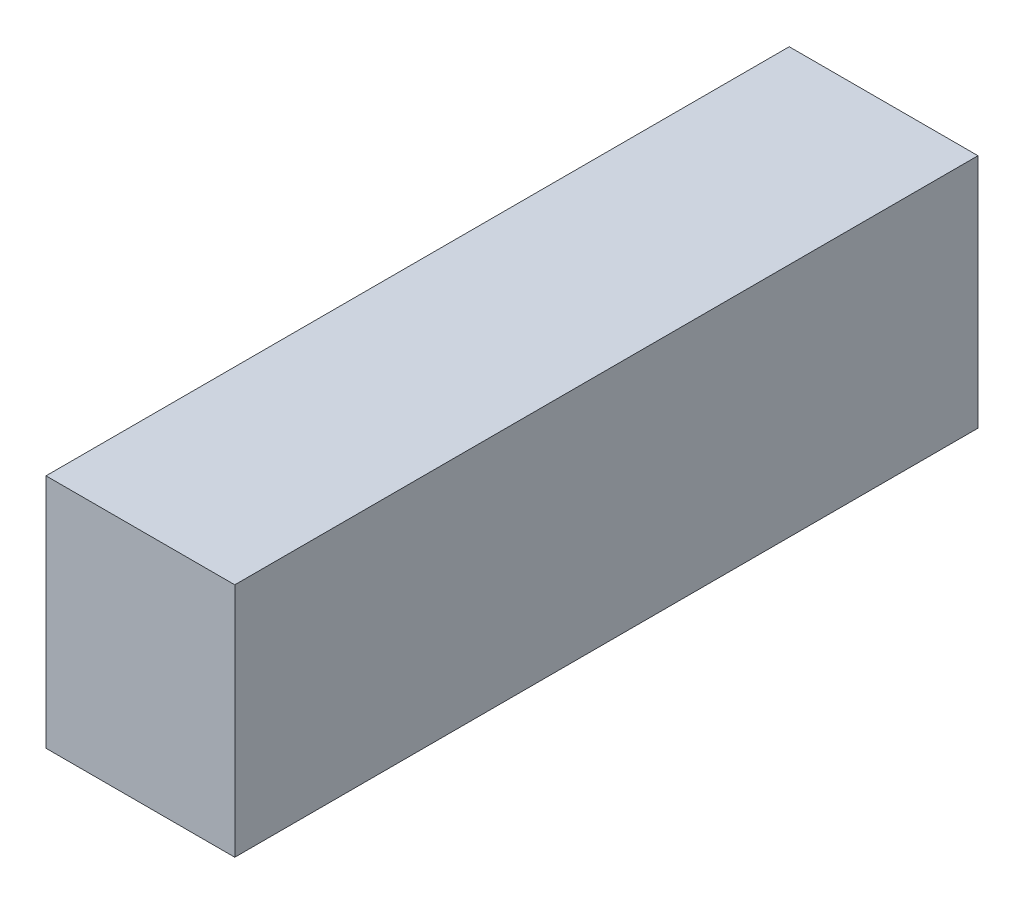
ISO-10303-21;
HEADER;
FILE_DESCRIPTION(('STEP AP214'),'2;1');
FILE_NAME('part.step','',(''),(''),'','','');
FILE_SCHEMA(('AUTOMOTIVE_DESIGN { 1 0 10303 214 1 1 1 1 }'));
ENDSEC;
DATA;
#1=APPLICATION_CONTEXT('core data for automotive mechanical design processes');
#2=APPLICATION_PROTOCOL_DEFINITION('international standard','automotive_design',2000,#1);
#3=PRODUCT_CONTEXT('',#1,'mechanical');
#4=PRODUCT('Part','Part','',(#3));
#5=PRODUCT_RELATED_PRODUCT_CATEGORY('part','',(#4));
#6=PRODUCT_DEFINITION_FORMATION('','',#4);
#7=PRODUCT_DEFINITION_CONTEXT('part definition',#1,'design');
#8=PRODUCT_DEFINITION('design','',#6,#7);
#9=PRODUCT_DEFINITION_SHAPE('','',#8);
#10=(LENGTH_UNIT() NAMED_UNIT(*) SI_UNIT(.MILLI.,.METRE.));
#11=(NAMED_UNIT(*) PLANE_ANGLE_UNIT() SI_UNIT($,.RADIAN.));
#12=(NAMED_UNIT(*) SI_UNIT($,.STERADIAN.) SOLID_ANGLE_UNIT());
#13=UNCERTAINTY_MEASURE_WITH_UNIT(LENGTH_MEASURE(1.E-05),#10,'distance_accuracy_value','');
#14=(GEOMETRIC_REPRESENTATION_CONTEXT(3) GLOBAL_UNCERTAINTY_ASSIGNED_CONTEXT((#13)) GLOBAL_UNIT_ASSIGNED_CONTEXT((#10,
#11,#12)) REPRESENTATION_CONTEXT('',''));
#15=CARTESIAN_POINT('',(0.,0.,0.));
#16=DIRECTION('',(0.,0.,1.));
#17=DIRECTION('',(1.,0.,0.));
#18=AXIS2_PLACEMENT_3D('',#15,#16,#17);
#19=CARTESIAN_POINT('',(3.175,2.38125,-304.8));
#20=DIRECTION('',(1.,0.,0.));
#21=DIRECTION('',(0.,1.,0.));
#22=AXIS2_PLACEMENT_3D('',#19,#20,#21);
#23=PLANE('',#22);
#24=DIRECTION('',(0.,1.,0.));
#25=VECTOR('',#24,1.);
#26=CARTESIAN_POINT('',(3.175,-2.38125,-304.8));
#27=LINE('',#26,#25);
#28=CARTESIAN_POINT('',(3.175,-5.55624999999995,-304.8));
#29=VERTEX_POINT('',#28);
#30=CARTESIAN_POINT('',(3.175,2.38125,-304.8));
#31=VERTEX_POINT('',#30);
#32=EDGE_CURVE('E55',#29,#31,#27,.T.);
#33=ORIENTED_EDGE('',*,*,#32,.T.);
#34=DIRECTION('',(0.,0.,1.));
#35=VECTOR('',#34,1.);
#36=CARTESIAN_POINT('',(3.175,2.38125,-304.8));
#37=LINE('',#36,#35);
#38=CARTESIAN_POINT('',(3.175,2.38125,-279.8));
#39=VERTEX_POINT('',#38);
#40=EDGE_CURVE('E67',#39,#31,#37,.F.);
#41=ORIENTED_EDGE('',*,*,#40,.F.);
#42=DIRECTION('',(0.,1.,0.));
#43=VECTOR('',#42,1.);
#44=CARTESIAN_POINT('',(3.175,-2.38125,-279.8));
#45=LINE('',#44,#43);
#46=CARTESIAN_POINT('',(3.175,-5.55624999999995,-279.8));
#47=VERTEX_POINT('',#46);
#48=EDGE_CURVE('E20',#47,#39,#45,.T.);
#49=ORIENTED_EDGE('',*,*,#48,.F.);
#50=DIRECTION('',(0.,0.,-1.));
#51=VECTOR('',#50,1.);
#52=CARTESIAN_POINT('',(3.175,-5.55624999999995,-304.8));
#53=LINE('',#52,#51);
#54=EDGE_CURVE('E81',#29,#47,#53,.F.);
#55=ORIENTED_EDGE('',*,*,#54,.F.);
#56=EDGE_LOOP('',(#33,#41,#49,#55));
#57=FACE_BOUND('',#56,.T.);
#58=ADVANCED_FACE('F17',(#57),#23,.T.);
#59=CARTESIAN_POINT('',(-2.38125,-2.38125,-279.8));
#60=DIRECTION('',(0.,0.,1.));
#61=DIRECTION('',(1.,0.,0.));
#62=AXIS2_PLACEMENT_3D('',#59,#60,#61);
#63=PLANE('',#62);
#64=ORIENTED_EDGE('',*,*,#48,.T.);
#65=DIRECTION('',(1.,0.,0.));
#66=VECTOR('',#65,1.);
#67=CARTESIAN_POINT('',(-2.38125,2.38125,-279.8));
#68=LINE('',#67,#66);
#69=CARTESIAN_POINT('',(-3.175,2.38125,-279.8));
#70=VERTEX_POINT('',#69);
#71=EDGE_CURVE('E62',#70,#39,#68,.T.);
#72=ORIENTED_EDGE('',*,*,#71,.F.);
#73=DIRECTION('',(0.,1.,0.));
#74=VECTOR('',#73,1.);
#75=CARTESIAN_POINT('',(-3.175,2.38125,-279.8));
#76=LINE('',#75,#74);
#77=CARTESIAN_POINT('',(-3.175,-5.55624999999995,-279.8));
#78=VERTEX_POINT('',#77);
#79=EDGE_CURVE('E83',#78,#70,#76,.T.);
#80=ORIENTED_EDGE('',*,*,#79,.F.);
#81=DIRECTION('',(1.,0.,0.));
#82=VECTOR('',#81,1.);
#83=CARTESIAN_POINT('',(-2.38125,-5.55624999999995,-279.8));
#84=LINE('',#83,#82);
#85=EDGE_CURVE('E65',#47,#78,#84,.F.);
#86=ORIENTED_EDGE('',*,*,#85,.F.);
#87=EDGE_LOOP('',(#64,#72,#80,#86));
#88=FACE_BOUND('',#87,.T.);
#89=ADVANCED_FACE('F60',(#88),#63,.T.);
#90=CARTESIAN_POINT('',(-2.38125,2.38125,-304.8));
#91=DIRECTION('',(0.,1.,0.));
#92=DIRECTION('',(0.,0.,1.));
#93=AXIS2_PLACEMENT_3D('',#90,#91,#92);
#94=PLANE('',#93);
#95=DIRECTION('',(1.,0.,0.));
#96=VECTOR('',#95,1.);
#97=CARTESIAN_POINT('',(-2.38125,2.38125,-304.8));
#98=LINE('',#97,#96);
#99=CARTESIAN_POINT('',(-3.175,2.38125,-304.8));
#100=VERTEX_POINT('',#99);
#101=EDGE_CURVE('E77',#31,#100,#98,.F.);
#102=ORIENTED_EDGE('',*,*,#101,.T.);
#103=DIRECTION('',(0.,0.,1.));
#104=VECTOR('',#103,1.);
#105=CARTESIAN_POINT('',(-3.175,2.38125,-304.8));
#106=LINE('',#105,#104);
#107=EDGE_CURVE('E73',#70,#100,#106,.F.);
#108=ORIENTED_EDGE('',*,*,#107,.F.);
#109=ORIENTED_EDGE('',*,*,#71,.T.);
#110=ORIENTED_EDGE('',*,*,#40,.T.);
#111=EDGE_LOOP('',(#102,#108,#109,#110));
#112=FACE_BOUND('',#111,.T.);
#113=ADVANCED_FACE('F71',(#112),#94,.T.);
#114=CARTESIAN_POINT('',(-2.38125,-2.38125,-304.8));
#115=DIRECTION('',(0.,0.,1.));
#116=DIRECTION('',(1.,0.,0.));
#117=AXIS2_PLACEMENT_3D('',#114,#115,#116);
#118=PLANE('',#117);
#119=ORIENTED_EDGE('',*,*,#101,.F.);
#120=ORIENTED_EDGE('',*,*,#32,.F.);
#121=DIRECTION('',(1.,0.,0.));
#122=VECTOR('',#121,1.);
#123=CARTESIAN_POINT('',(-2.38125,-5.55624999999995,-304.8));
#124=LINE('',#123,#122);
#125=CARTESIAN_POINT('',(-3.175,-5.55624999999995,-304.8));
#126=VERTEX_POINT('',#125);
#127=EDGE_CURVE('E35',#126,#29,#124,.T.);
#128=ORIENTED_EDGE('',*,*,#127,.F.);
#129=DIRECTION('',(0.,1.,0.));
#130=VECTOR('',#129,1.);
#131=CARTESIAN_POINT('',(-3.175,2.38125,-304.8));
#132=LINE('',#131,#130);
#133=EDGE_CURVE('E26',#100,#126,#132,.F.);
#134=ORIENTED_EDGE('',*,*,#133,.F.);
#135=EDGE_LOOP('',(#119,#120,#128,#134));
#136=FACE_BOUND('',#135,.T.);
#137=ADVANCED_FACE('F89',(#136),#118,.F.);
#138=CARTESIAN_POINT('',(-2.38125,-5.55624999999995,-304.8));
#139=DIRECTION('',(0.,-1.,0.));
#140=DIRECTION('',(0.,0.,-1.));
#141=AXIS2_PLACEMENT_3D('',#138,#139,#140);
#142=PLANE('',#141);
#143=ORIENTED_EDGE('',*,*,#127,.T.);
#144=ORIENTED_EDGE('',*,*,#54,.T.);
#145=ORIENTED_EDGE('',*,*,#85,.T.);
#146=DIRECTION('',(0.,0.,1.));
#147=VECTOR('',#146,1.);
#148=CARTESIAN_POINT('',(-3.175,-5.55624999999995,-304.8));
#149=LINE('',#148,#147);
#150=EDGE_CURVE('E11',#126,#78,#149,.T.);
#151=ORIENTED_EDGE('',*,*,#150,.F.);
#152=EDGE_LOOP('',(#143,#144,#145,#151));
#153=FACE_BOUND('',#152,.T.);
#154=ADVANCED_FACE('F91',(#153),#142,.T.);
#155=CARTESIAN_POINT('',(-3.175,2.38125,-304.8));
#156=DIRECTION('',(-1.,0.,0.));
#157=DIRECTION('',(0.,0.,1.));
#158=AXIS2_PLACEMENT_3D('',#155,#156,#157);
#159=PLANE('',#158);
#160=ORIENTED_EDGE('',*,*,#133,.T.);
#161=ORIENTED_EDGE('',*,*,#150,.T.);
#162=ORIENTED_EDGE('',*,*,#79,.T.);
#163=ORIENTED_EDGE('',*,*,#107,.T.);
#164=EDGE_LOOP('',(#160,#161,#162,#163));
#165=FACE_BOUND('',#164,.T.);
#166=ADVANCED_FACE('F88',(#165),#159,.T.);
#167=CLOSED_SHELL('',(#58,#89,#113,#137,#154,#166));
#168=MANIFOLD_SOLID_BREP('B1',#167);
#169=ADVANCED_BREP_SHAPE_REPRESENTATION('',(#18,#168),#14);
#170=SHAPE_DEFINITION_REPRESENTATION(#9,#169);
ENDSEC;
END-ISO-10303-21;
